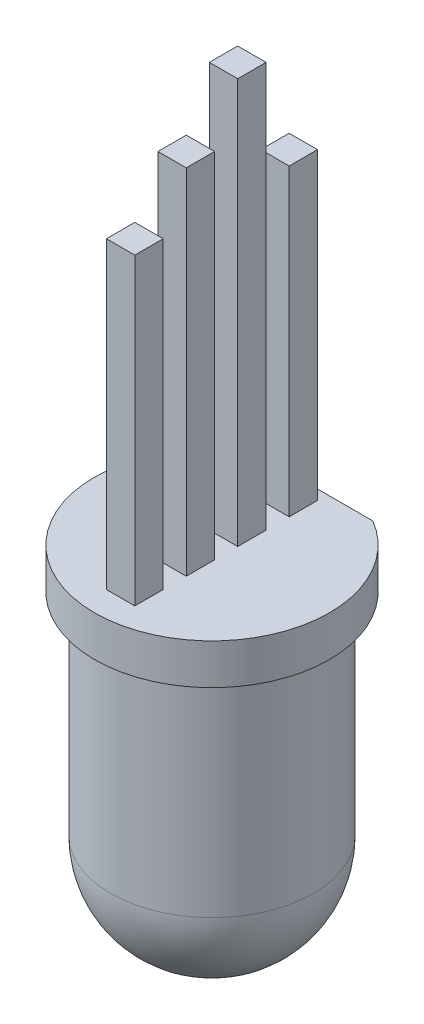
ISO-10303-21;
HEADER;
FILE_DESCRIPTION(('STEP AP214'),'2;1');
FILE_NAME('part.step','',(''),(''),'','','');
FILE_SCHEMA(('AUTOMOTIVE_DESIGN { 1 0 10303 214 1 1 1 1 }'));
ENDSEC;
DATA;
#1=APPLICATION_CONTEXT('core data for automotive mechanical design processes');
#2=APPLICATION_PROTOCOL_DEFINITION('international standard','automotive_design',2000,#1);
#3=PRODUCT_CONTEXT('',#1,'mechanical');
#4=PRODUCT('Part','Part','',(#3));
#5=PRODUCT_RELATED_PRODUCT_CATEGORY('part','',(#4));
#6=PRODUCT_DEFINITION_FORMATION('','',#4);
#7=PRODUCT_DEFINITION_CONTEXT('part definition',#1,'design');
#8=PRODUCT_DEFINITION('design','',#6,#7);
#9=PRODUCT_DEFINITION_SHAPE('','',#8);
#10=(LENGTH_UNIT() NAMED_UNIT(*) SI_UNIT(.MILLI.,.METRE.));
#11=(NAMED_UNIT(*) PLANE_ANGLE_UNIT() SI_UNIT($,.RADIAN.));
#12=(NAMED_UNIT(*) SI_UNIT($,.STERADIAN.) SOLID_ANGLE_UNIT());
#13=UNCERTAINTY_MEASURE_WITH_UNIT(LENGTH_MEASURE(1.E-05),#10,'distance_accuracy_value','');
#14=(GEOMETRIC_REPRESENTATION_CONTEXT(3) GLOBAL_UNCERTAINTY_ASSIGNED_CONTEXT((#13)) GLOBAL_UNIT_ASSIGNED_CONTEXT((#10,
#11,#12)) REPRESENTATION_CONTEXT('',''));
#15=CARTESIAN_POINT('',(0.,0.,0.));
#16=DIRECTION('',(0.,0.,1.));
#17=DIRECTION('',(1.,0.,0.));
#18=AXIS2_PLACEMENT_3D('',#15,#16,#17);
#19=CARTESIAN_POINT('',(2.90000000000001,8.7,0.));
#20=DIRECTION('',(0.,1.,0.));
#21=DIRECTION('',(-1.,0.,0.));
#22=AXIS2_PLACEMENT_3D('',#19,#20,#21);
#23=PLANE('',#22);
#24=DIRECTION('',(1.,0.,0.));
#25=VECTOR('',#24,1.);
#26=CARTESIAN_POINT('',(0.350000000000002,8.7,2.255));
#27=LINE('',#26,#25);
#28=CARTESIAN_POINT('',(-0.349999999999998,8.7,2.255));
#29=VERTEX_POINT('',#28);
#30=CARTESIAN_POINT('',(0.350000000000002,8.7,2.255));
#31=VERTEX_POINT('',#30);
#32=EDGE_CURVE('E263',#29,#31,#27,.T.);
#33=ORIENTED_EDGE('',*,*,#32,.F.);
#34=DIRECTION('',(0.,0.,1.));
#35=VECTOR('',#34,1.);
#36=CARTESIAN_POINT('',(-0.349999999999998,8.7,2.255));
#37=LINE('',#36,#35);
#38=CARTESIAN_POINT('',(-0.349999999999998,8.7,1.555));
#39=VERTEX_POINT('',#38);
#40=EDGE_CURVE('E260',#39,#29,#37,.T.);
#41=ORIENTED_EDGE('',*,*,#40,.F.);
#42=DIRECTION('',(-1.,0.,0.));
#43=VECTOR('',#42,1.);
#44=CARTESIAN_POINT('',(-0.349999999999998,8.7,1.555));
#45=LINE('',#44,#43);
#46=CARTESIAN_POINT('',(0.350000000000008,8.7,1.555));
#47=VERTEX_POINT('',#46);
#48=EDGE_CURVE('E269',#47,#39,#45,.T.);
#49=ORIENTED_EDGE('',*,*,#48,.F.);
#50=DIRECTION('',(0.,0.,-1.));
#51=VECTOR('',#50,1.);
#52=CARTESIAN_POINT('',(0.350000000000002,8.7,1.555));
#53=LINE('',#52,#51);
#54=EDGE_CURVE('E266',#31,#47,#53,.T.);
#55=ORIENTED_EDGE('',*,*,#54,.F.);
#56=EDGE_LOOP('',(#33,#41,#49,#55));
#57=FACE_BOUND('',#56,.T.);
#58=DIRECTION('',(1.,0.,0.));
#59=VECTOR('',#58,1.);
#60=CARTESIAN_POINT('',(0.350000000000002,8.7,-1.555));
#61=LINE('',#60,#59);
#62=CARTESIAN_POINT('',(-0.349999999999998,8.7,-1.555));
#63=VERTEX_POINT('',#62);
#64=CARTESIAN_POINT('',(0.350000000000002,8.7,-1.555));
#65=VERTEX_POINT('',#64);
#66=EDGE_CURVE('E181',#63,#65,#61,.T.);
#67=ORIENTED_EDGE('',*,*,#66,.F.);
#68=DIRECTION('',(0.,0.,1.));
#69=VECTOR('',#68,1.);
#70=CARTESIAN_POINT('',(-0.349999999999998,8.7,-1.555));
#71=LINE('',#70,#69);
#72=CARTESIAN_POINT('',(-0.349999999999998,8.7,-2.255));
#73=VERTEX_POINT('',#72);
#74=EDGE_CURVE('E298',#73,#63,#71,.T.);
#75=ORIENTED_EDGE('',*,*,#74,.F.);
#76=DIRECTION('',(-1.,0.,0.));
#77=VECTOR('',#76,1.);
#78=CARTESIAN_POINT('',(-0.349999999999998,8.7,-2.255));
#79=LINE('',#78,#77);
#80=CARTESIAN_POINT('',(0.350000000000007,8.7,-2.255));
#81=VERTEX_POINT('',#80);
#82=EDGE_CURVE('E304',#81,#73,#79,.T.);
#83=ORIENTED_EDGE('',*,*,#82,.F.);
#84=DIRECTION('',(0.,0.,-1.));
#85=VECTOR('',#84,1.);
#86=CARTESIAN_POINT('',(0.350000000000002,8.7,-2.255));
#87=LINE('',#86,#85);
#88=EDGE_CURVE('E302',#65,#81,#87,.T.);
#89=ORIENTED_EDGE('',*,*,#88,.F.);
#90=EDGE_LOOP('',(#67,#75,#83,#89));
#91=FACE_BOUND('',#90,.T.);
#92=DIRECTION('',(-1.,0.,0.));
#93=VECTOR('',#92,1.);
#94=CARTESIAN_POINT('',(-2.03164321843018,8.7,-2.5));
#95=LINE('',#94,#93);
#96=CARTESIAN_POINT('',(1.46969384566991,8.7,-2.5));
#97=VERTEX_POINT('',#96);
#98=CARTESIAN_POINT('',(-1.4696938456699,8.7,-2.5));
#99=VERTEX_POINT('',#98);
#100=EDGE_CURVE('E199',#97,#99,#95,.T.);
#101=ORIENTED_EDGE('',*,*,#100,.T.);
#102=CARTESIAN_POINT('',(0.,8.7,0.));
#103=DIRECTION('',(0.,-1.,0.));
#104=DIRECTION('',(1.,0.,0.));
#105=AXIS2_PLACEMENT_3D('',#102,#103,#104);
#106=CIRCLE('',#105,2.9);
#107=EDGE_CURVE('E11',#97,#99,#106,.T.);
#108=ORIENTED_EDGE('',*,*,#107,.F.);
#109=EDGE_LOOP('',(#101,#108));
#110=FACE_BOUND('',#109,.T.);
#111=DIRECTION('',(1.,0.,0.));
#112=VECTOR('',#111,1.);
#113=CARTESIAN_POINT('',(-0.349999999999994,8.7,0.985));
#114=LINE('',#113,#112);
#115=CARTESIAN_POINT('',(-0.349999999999994,8.7,0.985));
#116=VERTEX_POINT('',#115);
#117=CARTESIAN_POINT('',(0.350000000000006,8.7,0.985));
#118=VERTEX_POINT('',#117);
#119=EDGE_CURVE('E228',#116,#118,#114,.T.);
#120=ORIENTED_EDGE('',*,*,#119,.F.);
#121=DIRECTION('',(0.,0.,1.));
#122=VECTOR('',#121,1.);
#123=CARTESIAN_POINT('',(-0.349999999999994,8.7,0.285000000000001));
#124=LINE('',#123,#122);
#125=CARTESIAN_POINT('',(-0.349999999999994,8.7,0.285000000000001));
#126=VERTEX_POINT('',#125);
#127=EDGE_CURVE('E280',#126,#116,#124,.T.);
#128=ORIENTED_EDGE('',*,*,#127,.F.);
#129=DIRECTION('',(-1.,0.,0.));
#130=VECTOR('',#129,1.);
#131=CARTESIAN_POINT('',(0.350000000000006,8.7,0.285000000000001));
#132=LINE('',#131,#130);
#133=CARTESIAN_POINT('',(0.350000000000011,8.7,0.285000000000001));
#134=VERTEX_POINT('',#133);
#135=EDGE_CURVE('E287',#134,#126,#132,.T.);
#136=ORIENTED_EDGE('',*,*,#135,.F.);
#137=DIRECTION('',(0.,0.,-1.));
#138=VECTOR('',#137,1.);
#139=CARTESIAN_POINT('',(0.350000000000006,8.7,0.985));
#140=LINE('',#139,#138);
#141=EDGE_CURVE('E284',#118,#134,#140,.T.);
#142=ORIENTED_EDGE('',*,*,#141,.F.);
#143=EDGE_LOOP('',(#120,#128,#136,#142));
#144=FACE_BOUND('',#143,.T.);
#145=DIRECTION('',(1.,0.,0.));
#146=VECTOR('',#145,1.);
#147=CARTESIAN_POINT('',(0.350000000000003,8.7,-0.285000000000001));
#148=LINE('',#147,#146);
#149=CARTESIAN_POINT('',(-0.349999999999998,8.7,-0.285));
#150=VERTEX_POINT('',#149);
#151=CARTESIAN_POINT('',(0.350000000000003,8.7,-0.285000000000001));
#152=VERTEX_POINT('',#151);
#153=EDGE_CURVE('E232',#150,#152,#148,.T.);
#154=ORIENTED_EDGE('',*,*,#153,.F.);
#155=DIRECTION('',(0.,0.,1.));
#156=VECTOR('',#155,1.);
#157=CARTESIAN_POINT('',(-0.349999999999998,8.7,-0.285));
#158=LINE('',#157,#156);
#159=CARTESIAN_POINT('',(-0.349999999999998,8.7,-0.985));
#160=VERTEX_POINT('',#159);
#161=EDGE_CURVE('E235',#160,#150,#158,.T.);
#162=ORIENTED_EDGE('',*,*,#161,.F.);
#163=DIRECTION('',(-1.,0.,0.));
#164=VECTOR('',#163,1.);
#165=CARTESIAN_POINT('',(-0.349999999999998,8.7,-0.985));
#166=LINE('',#165,#164);
#167=CARTESIAN_POINT('',(0.350000000000008,8.7,-0.985));
#168=VERTEX_POINT('',#167);
#169=EDGE_CURVE('E242',#168,#160,#166,.T.);
#170=ORIENTED_EDGE('',*,*,#169,.F.);
#171=DIRECTION('',(0.,0.,-1.));
#172=VECTOR('',#171,1.);
#173=CARTESIAN_POINT('',(0.350000000000003,8.7,-0.985));
#174=LINE('',#173,#172);
#175=EDGE_CURVE('E237',#152,#168,#174,.T.);
#176=ORIENTED_EDGE('',*,*,#175,.F.);
#177=EDGE_LOOP('',(#154,#162,#170,#176));
#178=FACE_BOUND('',#177,.T.);
#179=ADVANCED_FACE('F36',(#57,#91,#110,#144,#178),#23,.T.);
#180=CARTESIAN_POINT('',(0.,2.5,0.));
#181=DIRECTION('',(0.,-1.,0.));
#182=DIRECTION('',(-1.,0.,0.));
#183=AXIS2_PLACEMENT_3D('',#180,#181,#182);
#184=SPHERICAL_SURFACE('',#183,2.5);
#185=CARTESIAN_POINT('',(0.,2.5,0.));
#186=DIRECTION('',(0.,-1.,0.));
#187=DIRECTION('',(1.,0.,0.));
#188=AXIS2_PLACEMENT_3D('',#185,#186,#187);
#189=CIRCLE('',#188,2.50000000000001);
#190=CARTESIAN_POINT('',(2.50000000000001,2.5,0.));
#191=VERTEX_POINT('',#190);
#192=EDGE_CURVE('E202',#191,#191,#189,.T.);
#193=ORIENTED_EDGE('',*,*,#192,.T.);
#194=EDGE_LOOP('',(#193));
#195=FACE_BOUND('',#194,.T.);
#196=ADVANCED_FACE('F38',(#195),#184,.T.);
#197=CARTESIAN_POINT('',(0.,0.,0.));
#198=DIRECTION('',(0.,-1.,0.));
#199=DIRECTION('',(1.,0.,0.));
#200=AXIS2_PLACEMENT_3D('',#197,#198,#199);
#201=CYLINDRICAL_SURFACE('',#200,2.9);
#202=DIRECTION('',(0.,-1.,0.));
#203=VECTOR('',#202,1.);
#204=CARTESIAN_POINT('',(-1.46969384566991,0.,-2.5));
#205=LINE('',#204,#203);
#206=CARTESIAN_POINT('',(-1.4696938456699,7.7,-2.5));
#207=VERTEX_POINT('',#206);
#208=EDGE_CURVE('E193',#99,#207,#205,.T.);
#209=ORIENTED_EDGE('',*,*,#208,.T.);
#210=CARTESIAN_POINT('',(0.,7.7,0.));
#211=DIRECTION('',(0.,-1.,0.));
#212=DIRECTION('',(1.,0.,0.));
#213=AXIS2_PLACEMENT_3D('',#210,#211,#212);
#214=CIRCLE('',#213,2.9);
#215=CARTESIAN_POINT('',(1.46969384566991,7.7,-2.5));
#216=VERTEX_POINT('',#215);
#217=EDGE_CURVE('E44',#216,#207,#214,.T.);
#218=ORIENTED_EDGE('',*,*,#217,.F.);
#219=DIRECTION('',(0.,-1.,0.));
#220=VECTOR('',#219,1.);
#221=CARTESIAN_POINT('',(1.46969384566991,0.,-2.5));
#222=LINE('',#221,#220);
#223=EDGE_CURVE('E185',#216,#97,#222,.F.);
#224=ORIENTED_EDGE('',*,*,#223,.T.);
#225=ORIENTED_EDGE('',*,*,#107,.T.);
#226=EDGE_LOOP('',(#209,#218,#224,#225));
#227=FACE_BOUND('',#226,.T.);
#228=ADVANCED_FACE('F215',(#227),#201,.T.);
#229=CARTESIAN_POINT('',(2.50000000000001,7.7,0.));
#230=DIRECTION('',(0.,-1.,0.));
#231=DIRECTION('',(1.,0.,0.));
#232=AXIS2_PLACEMENT_3D('',#229,#230,#231);
#233=PLANE('',#232);
#234=DIRECTION('',(-1.,0.,0.));
#235=VECTOR('',#234,1.);
#236=CARTESIAN_POINT('',(-2.03164321843019,7.7,-2.5));
#237=LINE('',#236,#235);
#238=CARTESIAN_POINT('',(0.,7.7,-2.5));
#239=VERTEX_POINT('',#238);
#240=EDGE_CURVE('E197',#216,#239,#237,.T.);
#241=ORIENTED_EDGE('',*,*,#240,.F.);
#242=ORIENTED_EDGE('',*,*,#217,.T.);
#243=EDGE_CURVE('E196',#239,#207,#237,.T.);
#244=ORIENTED_EDGE('',*,*,#243,.F.);
#245=CARTESIAN_POINT('',(0.,7.7,0.));
#246=DIRECTION('',(0.,-1.,0.));
#247=DIRECTION('',(1.,0.,0.));
#248=AXIS2_PLACEMENT_3D('',#245,#246,#247);
#249=CIRCLE('',#248,2.5);
#250=EDGE_CURVE('E205',#239,#239,#249,.T.);
#251=ORIENTED_EDGE('',*,*,#250,.F.);
#252=EDGE_LOOP('',(#241,#242,#244,#251));
#253=FACE_BOUND('',#252,.T.);
#254=ADVANCED_FACE('F212',(#253),#233,.T.);
#255=CARTESIAN_POINT('',(0.,0.,0.));
#256=DIRECTION('',(0.,-1.,0.));
#257=DIRECTION('',(1.,0.,0.));
#258=AXIS2_PLACEMENT_3D('',#255,#256,#257);
#259=CYLINDRICAL_SURFACE('',#258,2.5);
#260=ORIENTED_EDGE('',*,*,#250,.T.);
#261=EDGE_LOOP('',(#260));
#262=FACE_BOUND('',#261,.T.);
#263=ORIENTED_EDGE('',*,*,#192,.F.);
#264=EDGE_LOOP('',(#263));
#265=FACE_BOUND('',#264,.T.);
#266=ADVANCED_FACE('F405',(#262,#265),#259,.T.);
#267=CARTESIAN_POINT('',(-2.03164321843018,8.701,-2.5));
#268=DIRECTION('',(0.,0.,1.));
#269=DIRECTION('',(1.,0.,0.));
#270=AXIS2_PLACEMENT_3D('',#267,#268,#269);
#271=PLANE('',#270);
#272=ORIENTED_EDGE('',*,*,#100,.F.);
#273=ORIENTED_EDGE('',*,*,#223,.F.);
#274=ORIENTED_EDGE('',*,*,#240,.T.);
#275=ORIENTED_EDGE('',*,*,#243,.T.);
#276=ORIENTED_EDGE('',*,*,#208,.F.);
#277=EDGE_LOOP('',(#272,#273,#274,#275,#276));
#278=FACE_BOUND('',#277,.T.);
#279=ADVANCED_FACE('F218',(#278),#271,.F.);
#280=CARTESIAN_POINT('',(-0.349999999999992,18.7,-1.555));
#281=DIRECTION('',(1.,0.,0.));
#282=DIRECTION('',(0.,1.,0.));
#283=AXIS2_PLACEMENT_3D('',#280,#281,#282);
#284=PLANE('',#283);
#285=DIRECTION('',(0.,-1.,0.));
#286=VECTOR('',#285,1.);
#287=CARTESIAN_POINT('',(-0.349999999999992,18.7,-1.555));
#288=LINE('',#287,#286);
#289=CARTESIAN_POINT('',(-0.349999999999994,16.2,-1.555));
#290=VERTEX_POINT('',#289);
#291=EDGE_CURVE('E183',#290,#63,#288,.T.);
#292=ORIENTED_EDGE('',*,*,#291,.F.);
#293=DIRECTION('',(0.,0.,1.));
#294=VECTOR('',#293,1.);
#295=CARTESIAN_POINT('',(-0.349999999999994,16.2,-2.8850955673576));
#296=LINE('',#295,#294);
#297=CARTESIAN_POINT('',(-0.349999999999994,16.2,-2.255));
#298=VERTEX_POINT('',#297);
#299=EDGE_CURVE('E165',#298,#290,#296,.T.);
#300=ORIENTED_EDGE('',*,*,#299,.F.);
#301=DIRECTION('',(0.,-1.,0.));
#302=VECTOR('',#301,1.);
#303=CARTESIAN_POINT('',(-0.349999999999992,18.7,-2.255));
#304=LINE('',#303,#302);
#305=EDGE_CURVE('E187',#298,#73,#304,.T.);
#306=ORIENTED_EDGE('',*,*,#305,.T.);
#307=ORIENTED_EDGE('',*,*,#74,.T.);
#308=EDGE_LOOP('',(#292,#300,#306,#307));
#309=FACE_BOUND('',#308,.T.);
#310=ADVANCED_FACE('F308',(#309),#284,.F.);
#311=CARTESIAN_POINT('',(0.350000000000008,18.7,-1.555));
#312=DIRECTION('',(0.,0.,-1.));
#313=DIRECTION('',(-1.,0.,0.));
#314=AXIS2_PLACEMENT_3D('',#311,#312,#313);
#315=PLANE('',#314);
#316=DIRECTION('',(0.,-1.,0.));
#317=VECTOR('',#316,1.);
#318=CARTESIAN_POINT('',(0.350000000000008,18.7,-1.555));
#319=LINE('',#318,#317);
#320=CARTESIAN_POINT('',(0.350000000000007,16.2,-1.555));
#321=VERTEX_POINT('',#320);
#322=EDGE_CURVE('E174',#321,#65,#319,.T.);
#323=ORIENTED_EDGE('',*,*,#322,.F.);
#324=DIRECTION('',(1.,0.,0.));
#325=VECTOR('',#324,1.);
#326=CARTESIAN_POINT('',(2.90100000000002,16.2,-1.555));
#327=LINE('',#326,#325);
#328=EDGE_CURVE('E162',#290,#321,#327,.T.);
#329=ORIENTED_EDGE('',*,*,#328,.F.);
#330=ORIENTED_EDGE('',*,*,#291,.T.);
#331=ORIENTED_EDGE('',*,*,#66,.T.);
#332=EDGE_LOOP('',(#323,#329,#330,#331));
#333=FACE_BOUND('',#332,.T.);
#334=ADVANCED_FACE('F179',(#333),#315,.F.);
#335=CARTESIAN_POINT('',(0.350000000000008,18.7,-2.255));
#336=DIRECTION('',(-1.,0.,0.));
#337=DIRECTION('',(0.,-1.,0.));
#338=AXIS2_PLACEMENT_3D('',#335,#336,#337);
#339=PLANE('',#338);
#340=DIRECTION('',(0.,-1.,0.));
#341=VECTOR('',#340,1.);
#342=CARTESIAN_POINT('',(0.350000000000008,18.7,-2.255));
#343=LINE('',#342,#341);
#344=CARTESIAN_POINT('',(0.350000000000006,16.2,-2.255));
#345=VERTEX_POINT('',#344);
#346=EDGE_CURVE('E176',#345,#81,#343,.T.);
#347=ORIENTED_EDGE('',*,*,#346,.F.);
#348=DIRECTION('',(0.,0.,-1.));
#349=VECTOR('',#348,1.);
#350=CARTESIAN_POINT('',(0.350000000000007,16.2,-2.8850955673576));
#351=LINE('',#350,#349);
#352=EDGE_CURVE('E51',#321,#345,#351,.T.);
#353=ORIENTED_EDGE('',*,*,#352,.F.);
#354=ORIENTED_EDGE('',*,*,#322,.T.);
#355=ORIENTED_EDGE('',*,*,#88,.T.);
#356=EDGE_LOOP('',(#347,#353,#354,#355));
#357=FACE_BOUND('',#356,.T.);
#358=ADVANCED_FACE('F172',(#357),#339,.F.);
#359=CARTESIAN_POINT('',(-0.349999999999992,18.7,-2.255));
#360=DIRECTION('',(0.,0.,1.));
#361=DIRECTION('',(1.,0.,0.));
#362=AXIS2_PLACEMENT_3D('',#359,#360,#361);
#363=PLANE('',#362);
#364=ORIENTED_EDGE('',*,*,#305,.F.);
#365=DIRECTION('',(-1.,0.,0.));
#366=VECTOR('',#365,1.);
#367=CARTESIAN_POINT('',(2.90100000000002,16.2,-2.255));
#368=LINE('',#367,#366);
#369=EDGE_CURVE('E177',#345,#298,#368,.T.);
#370=ORIENTED_EDGE('',*,*,#369,.F.);
#371=ORIENTED_EDGE('',*,*,#346,.T.);
#372=ORIENTED_EDGE('',*,*,#82,.T.);
#373=EDGE_LOOP('',(#364,#370,#371,#372));
#374=FACE_BOUND('',#373,.T.);
#375=ADVANCED_FACE('F312',(#374),#363,.F.);
#376=CARTESIAN_POINT('',(-0.349999999999989,18.7,0.285000000000001));
#377=DIRECTION('',(1.,0.,0.));
#378=DIRECTION('',(0.,1.,0.));
#379=AXIS2_PLACEMENT_3D('',#376,#377,#378);
#380=PLANE('',#379);
#381=DIRECTION('',(0.,-1.,0.));
#382=VECTOR('',#381,1.);
#383=CARTESIAN_POINT('',(-0.349999999999988,18.7,0.985));
#384=LINE('',#383,#382);
#385=CARTESIAN_POINT('',(-0.349999999999989,17.43,0.985));
#386=VERTEX_POINT('',#385);
#387=EDGE_CURVE('E296',#386,#116,#384,.T.);
#388=ORIENTED_EDGE('',*,*,#387,.F.);
#389=DIRECTION('',(0.,0.,1.));
#390=VECTOR('',#389,1.);
#391=CARTESIAN_POINT('',(-0.349999999999993,17.43,0.));
#392=LINE('',#391,#390);
#393=CARTESIAN_POINT('',(-0.349999999999989,17.43,0.285000000000001));
#394=VERTEX_POINT('',#393);
#395=EDGE_CURVE('E328',#394,#386,#392,.T.);
#396=ORIENTED_EDGE('',*,*,#395,.F.);
#397=DIRECTION('',(0.,-1.,0.));
#398=VECTOR('',#397,1.);
#399=CARTESIAN_POINT('',(-0.349999999999989,18.7,0.285000000000001));
#400=LINE('',#399,#398);
#401=EDGE_CURVE('E290',#394,#126,#400,.T.);
#402=ORIENTED_EDGE('',*,*,#401,.T.);
#403=ORIENTED_EDGE('',*,*,#127,.T.);
#404=EDGE_LOOP('',(#388,#396,#402,#403));
#405=FACE_BOUND('',#404,.T.);
#406=ADVANCED_FACE('F390',(#405),#380,.F.);
#407=CARTESIAN_POINT('',(-0.349999999999988,18.7,0.985));
#408=DIRECTION('',(0.,0.,-1.));
#409=DIRECTION('',(-1.,0.,0.));
#410=AXIS2_PLACEMENT_3D('',#407,#408,#409);
#411=PLANE('',#410);
#412=DIRECTION('',(0.,-1.,0.));
#413=VECTOR('',#412,1.);
#414=CARTESIAN_POINT('',(0.350000000000011,18.7,0.985));
#415=LINE('',#414,#413);
#416=CARTESIAN_POINT('',(0.350000000000011,17.43,0.985));
#417=VERTEX_POINT('',#416);
#418=EDGE_CURVE('E294',#417,#118,#415,.T.);
#419=ORIENTED_EDGE('',*,*,#418,.F.);
#420=DIRECTION('',(1.,0.,0.));
#421=VECTOR('',#420,1.);
#422=CARTESIAN_POINT('',(2.90100000000002,17.43,0.985));
#423=LINE('',#422,#421);
#424=EDGE_CURVE('E326',#386,#417,#423,.T.);
#425=ORIENTED_EDGE('',*,*,#424,.F.);
#426=ORIENTED_EDGE('',*,*,#387,.T.);
#427=ORIENTED_EDGE('',*,*,#119,.T.);
#428=EDGE_LOOP('',(#419,#425,#426,#427));
#429=FACE_BOUND('',#428,.T.);
#430=ADVANCED_FACE('F386',(#429),#411,.F.);
#431=CARTESIAN_POINT('',(0.350000000000011,18.7,0.985));
#432=DIRECTION('',(-1.,0.,0.));
#433=DIRECTION('',(0.,-1.,0.));
#434=AXIS2_PLACEMENT_3D('',#431,#432,#433);
#435=PLANE('',#434);
#436=DIRECTION('',(0.,-1.,0.));
#437=VECTOR('',#436,1.);
#438=CARTESIAN_POINT('',(0.350000000000011,18.7,0.285000000000001));
#439=LINE('',#438,#437);
#440=CARTESIAN_POINT('',(0.350000000000011,17.43,0.285000000000001));
#441=VERTEX_POINT('',#440);
#442=EDGE_CURVE('E292',#441,#134,#439,.T.);
#443=ORIENTED_EDGE('',*,*,#442,.F.);
#444=DIRECTION('',(0.,0.,-1.));
#445=VECTOR('',#444,1.);
#446=CARTESIAN_POINT('',(0.35000000000001,17.43,0.));
#447=LINE('',#446,#445);
#448=EDGE_CURVE('E244',#417,#441,#447,.T.);
#449=ORIENTED_EDGE('',*,*,#448,.F.);
#450=ORIENTED_EDGE('',*,*,#418,.T.);
#451=ORIENTED_EDGE('',*,*,#141,.T.);
#452=EDGE_LOOP('',(#443,#449,#450,#451));
#453=FACE_BOUND('',#452,.T.);
#454=ADVANCED_FACE('F382',(#453),#435,.F.);
#455=CARTESIAN_POINT('',(0.350000000000011,18.7,0.285000000000001));
#456=DIRECTION('',(0.,0.,1.));
#457=DIRECTION('',(1.,0.,0.));
#458=AXIS2_PLACEMENT_3D('',#455,#456,#457);
#459=PLANE('',#458);
#460=ORIENTED_EDGE('',*,*,#401,.F.);
#461=DIRECTION('',(-1.,0.,0.));
#462=VECTOR('',#461,1.);
#463=CARTESIAN_POINT('',(2.90100000000002,17.43,0.285000000000001));
#464=LINE('',#463,#462);
#465=EDGE_CURVE('E322',#441,#394,#464,.T.);
#466=ORIENTED_EDGE('',*,*,#465,.F.);
#467=ORIENTED_EDGE('',*,*,#442,.T.);
#468=ORIENTED_EDGE('',*,*,#135,.T.);
#469=EDGE_LOOP('',(#460,#466,#467,#468));
#470=FACE_BOUND('',#469,.T.);
#471=ADVANCED_FACE('F378',(#470),#459,.F.);
#472=CARTESIAN_POINT('',(-0.349999999999992,18.7,2.255));
#473=DIRECTION('',(1.,0.,0.));
#474=DIRECTION('',(0.,1.,0.));
#475=AXIS2_PLACEMENT_3D('',#472,#473,#474);
#476=PLANE('',#475);
#477=DIRECTION('',(0.,-1.,0.));
#478=VECTOR('',#477,1.);
#479=CARTESIAN_POINT('',(-0.349999999999992,18.7,2.255));
#480=LINE('',#479,#478);
#481=CARTESIAN_POINT('',(-0.349999999999994,16.2,2.255));
#482=VERTEX_POINT('',#481);
#483=EDGE_CURVE('E278',#482,#29,#480,.T.);
#484=ORIENTED_EDGE('',*,*,#483,.F.);
#485=DIRECTION('',(0.,0.,1.));
#486=VECTOR('',#485,1.);
#487=CARTESIAN_POINT('',(-0.349999999999994,16.2,1.34441299144352));
#488=LINE('',#487,#486);
#489=CARTESIAN_POINT('',(-0.349999999999994,16.2,1.555));
#490=VERTEX_POINT('',#489);
#491=EDGE_CURVE('E319',#490,#482,#488,.T.);
#492=ORIENTED_EDGE('',*,*,#491,.F.);
#493=DIRECTION('',(0.,-1.,0.));
#494=VECTOR('',#493,1.);
#495=CARTESIAN_POINT('',(-0.349999999999992,18.7,1.555));
#496=LINE('',#495,#494);
#497=EDGE_CURVE('E272',#490,#39,#496,.T.);
#498=ORIENTED_EDGE('',*,*,#497,.T.);
#499=ORIENTED_EDGE('',*,*,#40,.T.);
#500=EDGE_LOOP('',(#484,#492,#498,#499));
#501=FACE_BOUND('',#500,.T.);
#502=ADVANCED_FACE('F374',(#501),#476,.F.);
#503=CARTESIAN_POINT('',(0.350000000000008,18.7,2.255));
#504=DIRECTION('',(0.,0.,-1.));
#505=DIRECTION('',(-1.,0.,0.));
#506=AXIS2_PLACEMENT_3D('',#503,#504,#505);
#507=PLANE('',#506);
#508=DIRECTION('',(0.,-1.,0.));
#509=VECTOR('',#508,1.);
#510=CARTESIAN_POINT('',(0.350000000000008,18.7,2.255));
#511=LINE('',#510,#509);
#512=CARTESIAN_POINT('',(0.350000000000007,16.2,2.255));
#513=VERTEX_POINT('',#512);
#514=EDGE_CURVE('E276',#513,#31,#511,.T.);
#515=ORIENTED_EDGE('',*,*,#514,.F.);
#516=DIRECTION('',(1.,0.,0.));
#517=VECTOR('',#516,1.);
#518=CARTESIAN_POINT('',(2.90100000000002,16.2,2.255));
#519=LINE('',#518,#517);
#520=EDGE_CURVE('E320',#482,#513,#519,.T.);
#521=ORIENTED_EDGE('',*,*,#520,.F.);
#522=ORIENTED_EDGE('',*,*,#483,.T.);
#523=ORIENTED_EDGE('',*,*,#32,.T.);
#524=EDGE_LOOP('',(#515,#521,#522,#523));
#525=FACE_BOUND('',#524,.T.);
#526=ADVANCED_FACE('F370',(#525),#507,.F.);
#527=CARTESIAN_POINT('',(0.350000000000008,18.7,1.555));
#528=DIRECTION('',(-1.,0.,0.));
#529=DIRECTION('',(0.,-1.,0.));
#530=AXIS2_PLACEMENT_3D('',#527,#528,#529);
#531=PLANE('',#530);
#532=DIRECTION('',(0.,-1.,0.));
#533=VECTOR('',#532,1.);
#534=CARTESIAN_POINT('',(0.350000000000008,18.7,1.555));
#535=LINE('',#534,#533);
#536=CARTESIAN_POINT('',(0.350000000000007,16.2,1.555));
#537=VERTEX_POINT('',#536);
#538=EDGE_CURVE('E274',#537,#47,#535,.T.);
#539=ORIENTED_EDGE('',*,*,#538,.F.);
#540=DIRECTION('',(0.,0.,-1.));
#541=VECTOR('',#540,1.);
#542=CARTESIAN_POINT('',(0.350000000000007,16.2,1.34441299144352));
#543=LINE('',#542,#541);
#544=EDGE_CURVE('E59',#513,#537,#543,.T.);
#545=ORIENTED_EDGE('',*,*,#544,.F.);
#546=ORIENTED_EDGE('',*,*,#514,.T.);
#547=ORIENTED_EDGE('',*,*,#54,.T.);
#548=EDGE_LOOP('',(#539,#545,#546,#547));
#549=FACE_BOUND('',#548,.T.);
#550=ADVANCED_FACE('F366',(#549),#531,.F.);
#551=CARTESIAN_POINT('',(-0.349999999999992,18.7,1.555));
#552=DIRECTION('',(0.,0.,1.));
#553=DIRECTION('',(1.,0.,0.));
#554=AXIS2_PLACEMENT_3D('',#551,#552,#553);
#555=PLANE('',#554);
#556=ORIENTED_EDGE('',*,*,#497,.F.);
#557=DIRECTION('',(-1.,0.,0.));
#558=VECTOR('',#557,1.);
#559=CARTESIAN_POINT('',(2.90100000000002,16.2,1.555));
#560=LINE('',#559,#558);
#561=EDGE_CURVE('E315',#537,#490,#560,.T.);
#562=ORIENTED_EDGE('',*,*,#561,.F.);
#563=ORIENTED_EDGE('',*,*,#538,.T.);
#564=ORIENTED_EDGE('',*,*,#48,.T.);
#565=EDGE_LOOP('',(#556,#562,#563,#564));
#566=FACE_BOUND('',#565,.T.);
#567=ADVANCED_FACE('F363',(#566),#555,.F.);
#568=CARTESIAN_POINT('',(-0.349999999999992,18.7,-0.285));
#569=DIRECTION('',(1.,0.,0.));
#570=DIRECTION('',(0.,1.,0.));
#571=AXIS2_PLACEMENT_3D('',#568,#569,#570);
#572=PLANE('',#571);
#573=ORIENTED_EDGE('',*,*,#161,.T.);
#574=DIRECTION('',(0.,-1.,0.));
#575=VECTOR('',#574,1.);
#576=CARTESIAN_POINT('',(-0.349999999999992,18.7,-0.285));
#577=LINE('',#576,#575);
#578=CARTESIAN_POINT('',(-0.349999999999992,18.7,-0.285));
#579=VERTEX_POINT('',#578);
#580=EDGE_CURVE('E258',#579,#150,#577,.T.);
#581=ORIENTED_EDGE('',*,*,#580,.F.);
#582=DIRECTION('',(0.,0.,1.));
#583=VECTOR('',#582,1.);
#584=CARTESIAN_POINT('',(-0.349999999999992,18.7,-0.285));
#585=LINE('',#584,#583);
#586=CARTESIAN_POINT('',(-0.349999999999992,18.7,-0.985));
#587=VERTEX_POINT('',#586);
#588=EDGE_CURVE('E249',#587,#579,#585,.T.);
#589=ORIENTED_EDGE('',*,*,#588,.F.);
#590=DIRECTION('',(0.,-1.,0.));
#591=VECTOR('',#590,1.);
#592=CARTESIAN_POINT('',(-0.349999999999992,18.7,-0.985));
#593=LINE('',#592,#591);
#594=EDGE_CURVE('E250',#587,#160,#593,.T.);
#595=ORIENTED_EDGE('',*,*,#594,.T.);
#596=EDGE_LOOP('',(#573,#581,#589,#595));
#597=FACE_BOUND('',#596,.T.);
#598=ADVANCED_FACE('F347',(#597),#572,.F.);
#599=CARTESIAN_POINT('',(0.350000000000009,18.7,-0.285000000000001));
#600=DIRECTION('',(0.,0.,-1.));
#601=DIRECTION('',(-1.,0.,0.));
#602=AXIS2_PLACEMENT_3D('',#599,#600,#601);
#603=PLANE('',#602);
#604=ORIENTED_EDGE('',*,*,#153,.T.);
#605=DIRECTION('',(0.,-1.,0.));
#606=VECTOR('',#605,1.);
#607=CARTESIAN_POINT('',(0.350000000000009,18.7,-0.285000000000001));
#608=LINE('',#607,#606);
#609=CARTESIAN_POINT('',(0.350000000000009,18.7,-0.285000000000001));
#610=VERTEX_POINT('',#609);
#611=EDGE_CURVE('E256',#610,#152,#608,.T.);
#612=ORIENTED_EDGE('',*,*,#611,.F.);
#613=DIRECTION('',(1.,0.,0.));
#614=VECTOR('',#613,1.);
#615=CARTESIAN_POINT('',(0.350000000000009,18.7,-0.285000000000001));
#616=LINE('',#615,#614);
#617=EDGE_CURVE('E333',#579,#610,#616,.T.);
#618=ORIENTED_EDGE('',*,*,#617,.F.);
#619=ORIENTED_EDGE('',*,*,#580,.T.);
#620=EDGE_LOOP('',(#604,#612,#618,#619));
#621=FACE_BOUND('',#620,.T.);
#622=ADVANCED_FACE('F348',(#621),#603,.F.);
#623=CARTESIAN_POINT('',(0.350000000000008,18.7,-0.985));
#624=DIRECTION('',(-1.,0.,0.));
#625=DIRECTION('',(0.,-1.,0.));
#626=AXIS2_PLACEMENT_3D('',#623,#624,#625);
#627=PLANE('',#626);
#628=ORIENTED_EDGE('',*,*,#175,.T.);
#629=DIRECTION('',(0.,-1.,0.));
#630=VECTOR('',#629,1.);
#631=CARTESIAN_POINT('',(0.350000000000008,18.7,-0.985));
#632=LINE('',#631,#630);
#633=CARTESIAN_POINT('',(0.350000000000008,18.7,-0.985));
#634=VERTEX_POINT('',#633);
#635=EDGE_CURVE('E253',#634,#168,#632,.T.);
#636=ORIENTED_EDGE('',*,*,#635,.F.);
#637=DIRECTION('',(0.,0.,-1.));
#638=VECTOR('',#637,1.);
#639=CARTESIAN_POINT('',(0.350000000000008,18.7,-0.985));
#640=LINE('',#639,#638);
#641=EDGE_CURVE('E335',#610,#634,#640,.T.);
#642=ORIENTED_EDGE('',*,*,#641,.F.);
#643=ORIENTED_EDGE('',*,*,#611,.T.);
#644=EDGE_LOOP('',(#628,#636,#642,#643));
#645=FACE_BOUND('',#644,.T.);
#646=ADVANCED_FACE('F350',(#645),#627,.F.);
#647=CARTESIAN_POINT('',(-0.349999999999992,18.7,-0.985));
#648=DIRECTION('',(0.,0.,1.));
#649=DIRECTION('',(1.,0.,0.));
#650=AXIS2_PLACEMENT_3D('',#647,#648,#649);
#651=PLANE('',#650);
#652=ORIENTED_EDGE('',*,*,#169,.T.);
#653=ORIENTED_EDGE('',*,*,#594,.F.);
#654=DIRECTION('',(-1.,0.,0.));
#655=VECTOR('',#654,1.);
#656=CARTESIAN_POINT('',(-0.349999999999992,18.7,-0.985));
#657=LINE('',#656,#655);
#658=EDGE_CURVE('E254',#634,#587,#657,.T.);
#659=ORIENTED_EDGE('',*,*,#658,.F.);
#660=ORIENTED_EDGE('',*,*,#635,.T.);
#661=EDGE_LOOP('',(#652,#653,#659,#660));
#662=FACE_BOUND('',#661,.T.);
#663=ADVANCED_FACE('F345',(#662),#651,.F.);
#664=CARTESIAN_POINT('',(0.,18.7,0.));
#665=DIRECTION('',(0.,-1.,0.));
#666=DIRECTION('',(0.,0.,-1.));
#667=AXIS2_PLACEMENT_3D('',#664,#665,#666);
#668=PLANE('',#667);
#669=ORIENTED_EDGE('',*,*,#588,.T.);
#670=ORIENTED_EDGE('',*,*,#617,.T.);
#671=ORIENTED_EDGE('',*,*,#641,.T.);
#672=ORIENTED_EDGE('',*,*,#658,.T.);
#673=EDGE_LOOP('',(#669,#670,#671,#672));
#674=FACE_BOUND('',#673,.T.);
#675=ADVANCED_FACE('F339',(#674),#668,.F.);
#676=CARTESIAN_POINT('',(2.90100000000002,17.43,0.));
#677=DIRECTION('',(0.,-1.,0.));
#678=DIRECTION('',(1.,0.,0.));
#679=AXIS2_PLACEMENT_3D('',#676,#677,#678);
#680=PLANE('',#679);
#681=ORIENTED_EDGE('',*,*,#424,.T.);
#682=ORIENTED_EDGE('',*,*,#448,.T.);
#683=ORIENTED_EDGE('',*,*,#465,.T.);
#684=ORIENTED_EDGE('',*,*,#395,.T.);
#685=EDGE_LOOP('',(#681,#682,#683,#684));
#686=FACE_BOUND('',#685,.T.);
#687=ADVANCED_FACE('F462',(#686),#680,.F.);
#688=CARTESIAN_POINT('',(2.90100000000002,16.2,1.34441299144352));
#689=DIRECTION('',(0.,-1.,0.));
#690=DIRECTION('',(1.,0.,0.));
#691=AXIS2_PLACEMENT_3D('',#688,#689,#690);
#692=PLANE('',#691);
#693=ORIENTED_EDGE('',*,*,#520,.T.);
#694=ORIENTED_EDGE('',*,*,#544,.T.);
#695=ORIENTED_EDGE('',*,*,#561,.T.);
#696=ORIENTED_EDGE('',*,*,#491,.T.);
#697=EDGE_LOOP('',(#693,#694,#695,#696));
#698=FACE_BOUND('',#697,.T.);
#699=ADVANCED_FACE('F541',(#698),#692,.F.);
#700=CARTESIAN_POINT('',(2.90100000000002,16.2,-2.8850955673576));
#701=DIRECTION('',(0.,-1.,0.));
#702=DIRECTION('',(1.,0.,0.));
#703=AXIS2_PLACEMENT_3D('',#700,#701,#702);
#704=PLANE('',#703);
#705=ORIENTED_EDGE('',*,*,#328,.T.);
#706=ORIENTED_EDGE('',*,*,#352,.T.);
#707=ORIENTED_EDGE('',*,*,#369,.T.);
#708=ORIENTED_EDGE('',*,*,#299,.T.);
#709=EDGE_LOOP('',(#705,#706,#707,#708));
#710=FACE_BOUND('',#709,.T.);
#711=ADVANCED_FACE('F163',(#710),#704,.F.);
#712=CLOSED_SHELL('',(#179,#196,#228,#254,#266,#279,#310,#334,#358,#375,#406,#430,#454,#471,
#502,#526,#550,#567,#598,#622,#646,#663,#675,#687,#699,#711));
#713=MANIFOLD_SOLID_BREP('B2',#712);
#714=ADVANCED_BREP_SHAPE_REPRESENTATION('',(#18,#713),#14);
#715=SHAPE_DEFINITION_REPRESENTATION(#9,#714);
ENDSEC;
END-ISO-10303-21;
